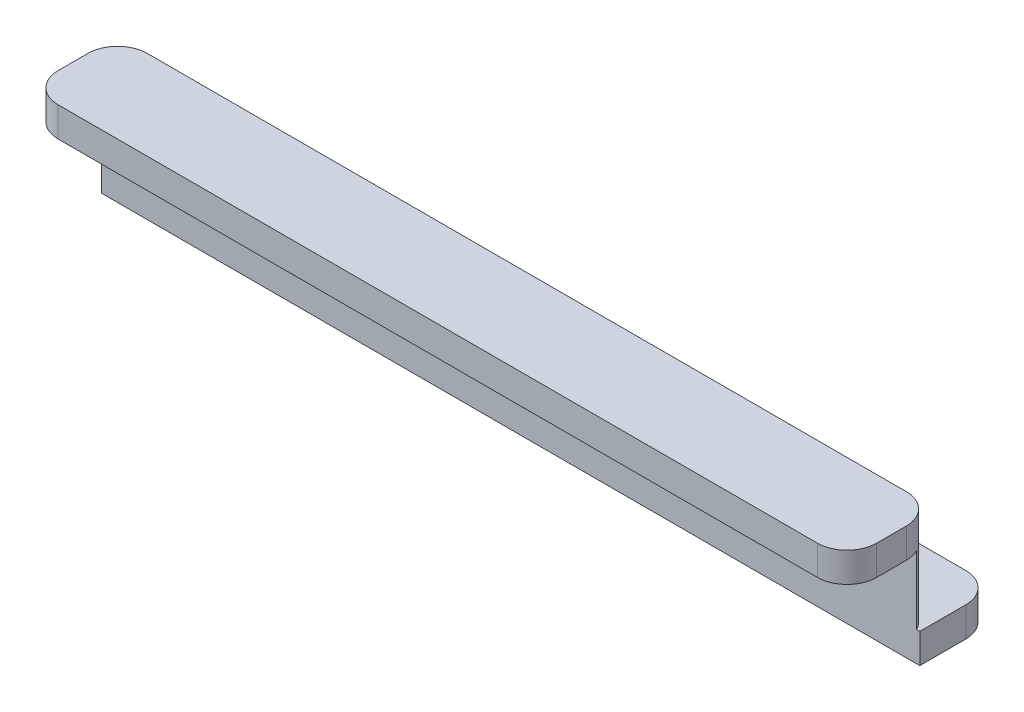
ISO-10303-21;
HEADER;
FILE_DESCRIPTION(('STEP AP214'),'2;1');
FILE_NAME('part.step','',(''),(''),'','','');
FILE_SCHEMA(('AUTOMOTIVE_DESIGN { 1 0 10303 214 1 1 1 1 }'));
ENDSEC;
DATA;
#1=APPLICATION_CONTEXT('core data for automotive mechanical design processes');
#2=APPLICATION_PROTOCOL_DEFINITION('international standard','automotive_design',2000,#1);
#3=PRODUCT_CONTEXT('',#1,'mechanical');
#4=PRODUCT('Part','Part','',(#3));
#5=PRODUCT_RELATED_PRODUCT_CATEGORY('part','',(#4));
#6=PRODUCT_DEFINITION_FORMATION('','',#4);
#7=PRODUCT_DEFINITION_CONTEXT('part definition',#1,'design');
#8=PRODUCT_DEFINITION('design','',#6,#7);
#9=PRODUCT_DEFINITION_SHAPE('','',#8);
#10=(LENGTH_UNIT() NAMED_UNIT(*) SI_UNIT(.MILLI.,.METRE.));
#11=(NAMED_UNIT(*) PLANE_ANGLE_UNIT() SI_UNIT($,.RADIAN.));
#12=(NAMED_UNIT(*) SI_UNIT($,.STERADIAN.) SOLID_ANGLE_UNIT());
#13=UNCERTAINTY_MEASURE_WITH_UNIT(LENGTH_MEASURE(1.E-05),#10,'distance_accuracy_value','');
#14=(GEOMETRIC_REPRESENTATION_CONTEXT(3) GLOBAL_UNCERTAINTY_ASSIGNED_CONTEXT((#13)) GLOBAL_UNIT_ASSIGNED_CONTEXT((#10,
#11,#12)) REPRESENTATION_CONTEXT('',''));
#15=CARTESIAN_POINT('',(0.,0.,0.));
#16=DIRECTION('',(0.,0.,1.));
#17=DIRECTION('',(1.,0.,0.));
#18=AXIS2_PLACEMENT_3D('',#15,#16,#17);
#19=CARTESIAN_POINT('',(53.15,2.,-4.));
#20=DIRECTION('',(0.,-1.,0.));
#21=DIRECTION('',(0.,0.,-1.));
#22=AXIS2_PLACEMENT_3D('',#19,#20,#21);
#23=CYLINDRICAL_SURFACE('',#22,2.);
#24=DIRECTION('',(0.,-1.,0.));
#25=VECTOR('',#24,1.);
#26=CARTESIAN_POINT('',(54.9360571099495,2.,-4.89999999999942));
#27=LINE('',#26,#25);
#28=CARTESIAN_POINT('',(54.9360571099494,-4.60000000000129,-4.89999999999942));
#29=VERTEX_POINT('',#28);
#30=CARTESIAN_POINT('',(54.9360571099495,0.,-4.89999999999942));
#31=VERTEX_POINT('',#30);
#32=EDGE_CURVE('E215',#29,#31,#27,.F.);
#33=ORIENTED_EDGE('',*,*,#32,.F.);
#34=CARTESIAN_POINT('',(53.15,-4.6000000000013,-4.));
#35=DIRECTION('',(0.,1.,0.));
#36=DIRECTION('',(1.,0.,0.));
#37=AXIS2_PLACEMENT_3D('',#34,#35,#36);
#38=CIRCLE('',#37,2.);
#39=CARTESIAN_POINT('',(53.15,-4.6000000000013,-5.99999999999999));
#40=VERTEX_POINT('',#39);
#41=EDGE_CURVE('E253',#29,#40,#38,.T.);
#42=ORIENTED_EDGE('',*,*,#41,.T.);
#43=DIRECTION('',(0.,-1.,0.));
#44=VECTOR('',#43,1.);
#45=CARTESIAN_POINT('',(53.15,2.,-6.));
#46=LINE('',#45,#44);
#47=CARTESIAN_POINT('',(53.15,2.,-6.));
#48=VERTEX_POINT('',#47);
#49=EDGE_CURVE('E209',#48,#40,#46,.T.);
#50=ORIENTED_EDGE('',*,*,#49,.F.);
#51=CARTESIAN_POINT('',(53.15,2.,-4.));
#52=DIRECTION('',(0.,1.,0.));
#53=DIRECTION('',(0.,0.,-1.));
#54=AXIS2_PLACEMENT_3D('',#51,#52,#53);
#55=CIRCLE('',#54,2.);
#56=CARTESIAN_POINT('',(55.15,2.,-4.));
#57=VERTEX_POINT('',#56);
#58=EDGE_CURVE('E168',#57,#48,#55,.T.);
#59=ORIENTED_EDGE('',*,*,#58,.F.);
#60=DIRECTION('',(0.,-1.,0.));
#61=VECTOR('',#60,1.);
#62=CARTESIAN_POINT('',(55.15,2.,-4.));
#63=LINE('',#62,#61);
#64=CARTESIAN_POINT('',(55.15,0.,-4.));
#65=VERTEX_POINT('',#64);
#66=EDGE_CURVE('E185',#57,#65,#63,.T.);
#67=ORIENTED_EDGE('',*,*,#66,.T.);
#68=CARTESIAN_POINT('',(53.15,0.,-4.));
#69=DIRECTION('',(0.,1.,0.));
#70=DIRECTION('',(0.,0.,1.));
#71=AXIS2_PLACEMENT_3D('',#68,#69,#70);
#72=CIRCLE('',#71,2.);
#73=EDGE_CURVE('E226',#65,#31,#72,.T.);
#74=ORIENTED_EDGE('',*,*,#73,.T.);
#75=EDGE_LOOP('',(#33,#42,#50,#59,#67,#74));
#76=FACE_BOUND('',#75,.T.);
#77=ADVANCED_FACE('F32',(#76),#23,.T.);
#78=CARTESIAN_POINT('',(2.,2.,-4.));
#79=DIRECTION('',(0.,-1.,0.));
#80=DIRECTION('',(0.,0.,-1.));
#81=AXIS2_PLACEMENT_3D('',#78,#79,#80);
#82=CYLINDRICAL_SURFACE('',#81,2.);
#83=DIRECTION('',(0.,-1.,0.));
#84=VECTOR('',#83,1.);
#85=CARTESIAN_POINT('',(0.213942890050535,2.,-4.89999999999942));
#86=LINE('',#85,#84);
#87=CARTESIAN_POINT('',(0.213942890050535,0.,-4.89999999999942));
#88=VERTEX_POINT('',#87);
#89=CARTESIAN_POINT('',(0.213942890050525,-4.60000000000167,-4.89999999999942));
#90=VERTEX_POINT('',#89);
#91=EDGE_CURVE('E52',#88,#90,#86,.T.);
#92=ORIENTED_EDGE('',*,*,#91,.F.);
#93=CARTESIAN_POINT('',(2.,0.,-4.));
#94=DIRECTION('',(0.,1.,0.));
#95=DIRECTION('',(0.,0.,1.));
#96=AXIS2_PLACEMENT_3D('',#93,#94,#95);
#97=CIRCLE('',#96,2.);
#98=CARTESIAN_POINT('',(0.,0.,-4.));
#99=VERTEX_POINT('',#98);
#100=EDGE_CURVE('E219',#88,#99,#97,.T.);
#101=ORIENTED_EDGE('',*,*,#100,.T.);
#102=DIRECTION('',(0.,-1.,0.));
#103=VECTOR('',#102,1.);
#104=CARTESIAN_POINT('',(0.,2.,-4.));
#105=LINE('',#104,#103);
#106=CARTESIAN_POINT('',(0.,2.,-4.));
#107=VERTEX_POINT('',#106);
#108=EDGE_CURVE('E203',#107,#99,#105,.T.);
#109=ORIENTED_EDGE('',*,*,#108,.F.);
#110=CARTESIAN_POINT('',(2.,2.,-4.));
#111=DIRECTION('',(0.,1.,0.));
#112=DIRECTION('',(0.,0.,-1.));
#113=AXIS2_PLACEMENT_3D('',#110,#111,#112);
#114=CIRCLE('',#113,2.);
#115=CARTESIAN_POINT('',(2.,2.,-6.));
#116=VERTEX_POINT('',#115);
#117=EDGE_CURVE('E174',#116,#107,#114,.T.);
#118=ORIENTED_EDGE('',*,*,#117,.F.);
#119=DIRECTION('',(0.,-1.,0.));
#120=VECTOR('',#119,1.);
#121=CARTESIAN_POINT('',(2.,2.,-6.));
#122=LINE('',#121,#120);
#123=CARTESIAN_POINT('',(1.99999999999999,-4.60000000000165,-5.99999999999999));
#124=VERTEX_POINT('',#123);
#125=EDGE_CURVE('E206',#116,#124,#122,.T.);
#126=ORIENTED_EDGE('',*,*,#125,.T.);
#127=CARTESIAN_POINT('',(1.99999999999999,-4.60000000000166,-4.));
#128=DIRECTION('',(0.,1.,0.));
#129=DIRECTION('',(1.,0.,0.));
#130=AXIS2_PLACEMENT_3D('',#127,#128,#129);
#131=CIRCLE('',#130,2.);
#132=EDGE_CURVE('E230',#124,#90,#131,.T.);
#133=ORIENTED_EDGE('',*,*,#132,.T.);
#134=EDGE_LOOP('',(#92,#101,#109,#118,#126,#133));
#135=FACE_BOUND('',#134,.T.);
#136=ADVANCED_FACE('F229',(#135),#82,.T.);
#137=CARTESIAN_POINT('',(0.,2.,-2.));
#138=DIRECTION('',(1.,0.,0.));
#139=DIRECTION('',(0.,0.,-1.));
#140=AXIS2_PLACEMENT_3D('',#137,#138,#139);
#141=PLANE('',#140);
#142=DIRECTION('',(0.,1.,0.));
#143=VECTOR('',#142,1.);
#144=CARTESIAN_POINT('',(0.,-6.60000000000168,-4.89999999999942));
#145=LINE('',#144,#143);
#146=CARTESIAN_POINT('',(0.,-6.60000000000168,-4.89999999999942));
#147=VERTEX_POINT('',#146);
#148=CARTESIAN_POINT('',(0.,-4.60000000000148,-4.89999999999942));
#149=VERTEX_POINT('',#148);
#150=EDGE_CURVE('E153',#147,#149,#145,.T.);
#151=ORIENTED_EDGE('',*,*,#150,.T.);
#152=DIRECTION('',(0.,0.,-1.));
#153=VECTOR('',#152,1.);
#154=CARTESIAN_POINT('',(0.,-4.60000000000167,-4.));
#155=LINE('',#154,#153);
#156=CARTESIAN_POINT('',(0.,-4.60000000000166,-7.99999999999999));
#157=VERTEX_POINT('',#156);
#158=EDGE_CURVE('E238',#149,#157,#155,.T.);
#159=ORIENTED_EDGE('',*,*,#158,.T.);
#160=DIRECTION('',(0.,-1.,0.));
#161=VECTOR('',#160,1.);
#162=CARTESIAN_POINT('',(0.,-4.60000000000166,-7.99999999999999));
#163=LINE('',#162,#161);
#164=CARTESIAN_POINT('',(0.,-6.60000000000166,-8.));
#165=VERTEX_POINT('',#164);
#166=EDGE_CURVE('E160',#157,#165,#163,.T.);
#167=ORIENTED_EDGE('',*,*,#166,.T.);
#168=DIRECTION('',(0.,0.,-1.));
#169=VECTOR('',#168,1.);
#170=CARTESIAN_POINT('',(0.,-6.60000000000168,-3.99999999999987));
#171=LINE('',#170,#169);
#172=EDGE_CURVE('E146',#147,#165,#171,.T.);
#173=ORIENTED_EDGE('',*,*,#172,.F.);
#174=EDGE_LOOP('',(#151,#159,#167,#173));
#175=FACE_BOUND('',#174,.T.);
#176=ADVANCED_FACE('F158',(#175),#141,.F.);
#177=CARTESIAN_POINT('',(55.15,2.,-2.));
#178=DIRECTION('',(-1.,0.,0.));
#179=DIRECTION('',(0.,0.,1.));
#180=AXIS2_PLACEMENT_3D('',#177,#178,#179);
#181=PLANE('',#180);
#182=DIRECTION('',(0.,1.,0.));
#183=VECTOR('',#182,1.);
#184=CARTESIAN_POINT('',(55.15,-6.60000000000168,-4.89999999999942));
#185=LINE('',#184,#183);
#186=CARTESIAN_POINT('',(55.15,-6.60000000000168,-4.89999999999942));
#187=VERTEX_POINT('',#186);
#188=CARTESIAN_POINT('',(55.15,-4.60000000000129,-4.89999999999942));
#189=VERTEX_POINT('',#188);
#190=EDGE_CURVE('E45',#187,#189,#185,.T.);
#191=ORIENTED_EDGE('',*,*,#190,.F.);
#192=DIRECTION('',(0.,0.,1.));
#193=VECTOR('',#192,1.);
#194=CARTESIAN_POINT('',(55.15,-6.60000000000129,-1.99999999999987));
#195=LINE('',#194,#193);
#196=CARTESIAN_POINT('',(55.15,-6.60000000000128,-8.));
#197=VERTEX_POINT('',#196);
#198=EDGE_CURVE('E149',#197,#187,#195,.T.);
#199=ORIENTED_EDGE('',*,*,#198,.F.);
#200=DIRECTION('',(0.,-1.,0.));
#201=VECTOR('',#200,1.);
#202=CARTESIAN_POINT('',(55.15,-4.60000000000128,-7.99999999999999));
#203=LINE('',#202,#201);
#204=CARTESIAN_POINT('',(55.15,-4.60000000000128,-7.99999999999999));
#205=VERTEX_POINT('',#204);
#206=EDGE_CURVE('E150',#205,#197,#203,.T.);
#207=ORIENTED_EDGE('',*,*,#206,.F.);
#208=DIRECTION('',(0.,0.,1.));
#209=VECTOR('',#208,1.);
#210=CARTESIAN_POINT('',(55.15,-4.60000000000128,-7.99999999999999));
#211=LINE('',#210,#209);
#212=EDGE_CURVE('E250',#205,#189,#211,.T.);
#213=ORIENTED_EDGE('',*,*,#212,.T.);
#214=EDGE_LOOP('',(#191,#199,#207,#213));
#215=FACE_BOUND('',#214,.T.);
#216=ADVANCED_FACE('F282',(#215),#181,.F.);
#217=CARTESIAN_POINT('',(58.1670864842163,-6.60000000000159,134.695));
#218=DIRECTION('',(0.,1.,0.));
#219=DIRECTION('',(-1.,0.,0.));
#220=AXIS2_PLACEMENT_3D('',#217,#218,#219);
#221=PLANE('',#220);
#222=DIRECTION('',(-1.,0.,0.));
#223=VECTOR('',#222,1.);
#224=CARTESIAN_POINT('',(3.99999999999824,-6.60000000000165,-4.89999999999942));
#225=LINE('',#224,#223);
#226=EDGE_CURVE('E141',#187,#147,#225,.T.);
#227=ORIENTED_EDGE('',*,*,#226,.T.);
#228=ORIENTED_EDGE('',*,*,#172,.T.);
#229=CARTESIAN_POINT('',(2.00000000000005,-6.60000000000165,-8.));
#230=DIRECTION('',(0.,-1.,0.));
#231=DIRECTION('',(1.,0.,0.));
#232=AXIS2_PLACEMENT_3D('',#229,#230,#231);
#233=CIRCLE('',#232,2.);
#234=CARTESIAN_POINT('',(2.00000000000005,-6.60000000000164,-10.));
#235=VERTEX_POINT('',#234);
#236=EDGE_CURVE('E236',#165,#235,#233,.T.);
#237=ORIENTED_EDGE('',*,*,#236,.T.);
#238=DIRECTION('',(1.,0.,0.));
#239=VECTOR('',#238,1.);
#240=CARTESIAN_POINT('',(2.00000000000005,-6.60000000000164,-10.));
#241=LINE('',#240,#239);
#242=CARTESIAN_POINT('',(53.15,-6.60000000000129,-10.));
#243=VERTEX_POINT('',#242);
#244=EDGE_CURVE('E259',#235,#243,#241,.T.);
#245=ORIENTED_EDGE('',*,*,#244,.T.);
#246=CARTESIAN_POINT('',(53.15,-6.60000000000129,-8.));
#247=DIRECTION('',(0.,-1.,0.));
#248=DIRECTION('',(1.,0.,0.));
#249=AXIS2_PLACEMENT_3D('',#246,#247,#248);
#250=CIRCLE('',#249,2.);
#251=EDGE_CURVE('E239',#243,#197,#250,.T.);
#252=ORIENTED_EDGE('',*,*,#251,.T.);
#253=ORIENTED_EDGE('',*,*,#198,.T.);
#254=EDGE_LOOP('',(#227,#228,#237,#245,#252,#253));
#255=FACE_BOUND('',#254,.T.);
#256=ADVANCED_FACE('F143',(#255),#221,.F.);
#257=CARTESIAN_POINT('',(1.99999999999999,-4.60000000000166,-4.));
#258=DIRECTION('',(0.,-1.,0.));
#259=DIRECTION('',(1.,0.,0.));
#260=AXIS2_PLACEMENT_3D('',#257,#258,#259);
#261=PLANE('',#260);
#262=DIRECTION('',(-1.,0.,0.));
#263=VECTOR('',#262,1.);
#264=CARTESIAN_POINT('',(1.99999999999999,-4.60000000000166,-4.89999999999942));
#265=LINE('',#264,#263);
#266=EDGE_CURVE('E11',#189,#29,#265,.T.);
#267=ORIENTED_EDGE('',*,*,#266,.F.);
#268=ORIENTED_EDGE('',*,*,#212,.F.);
#269=CARTESIAN_POINT('',(53.15,-4.60000000000129,-7.99999999999999));
#270=DIRECTION('',(0.,-1.,0.));
#271=DIRECTION('',(1.,0.,0.));
#272=AXIS2_PLACEMENT_3D('',#269,#270,#271);
#273=CIRCLE('',#272,2.);
#274=CARTESIAN_POINT('',(53.15,-4.60000000000129,-9.99999999999999));
#275=VERTEX_POINT('',#274);
#276=EDGE_CURVE('E247',#275,#205,#273,.T.);
#277=ORIENTED_EDGE('',*,*,#276,.F.);
#278=DIRECTION('',(1.,0.,0.));
#279=VECTOR('',#278,1.);
#280=CARTESIAN_POINT('',(2.00000000000003,-4.60000000000164,-9.99999999999999));
#281=LINE('',#280,#279);
#282=CARTESIAN_POINT('',(2.00000000000003,-4.60000000000164,-9.99999999999999));
#283=VERTEX_POINT('',#282);
#284=EDGE_CURVE('E244',#283,#275,#281,.T.);
#285=ORIENTED_EDGE('',*,*,#284,.F.);
#286=CARTESIAN_POINT('',(2.00000000000003,-4.60000000000165,-7.99999999999999));
#287=DIRECTION('',(0.,-1.,0.));
#288=DIRECTION('',(1.,0.,0.));
#289=AXIS2_PLACEMENT_3D('',#286,#287,#288);
#290=CIRCLE('',#289,2.);
#291=EDGE_CURVE('E241',#157,#283,#290,.T.);
#292=ORIENTED_EDGE('',*,*,#291,.F.);
#293=ORIENTED_EDGE('',*,*,#158,.F.);
#294=EDGE_CURVE('E35',#90,#149,#265,.T.);
#295=ORIENTED_EDGE('',*,*,#294,.F.);
#296=ORIENTED_EDGE('',*,*,#132,.F.);
#297=DIRECTION('',(-1.,0.,0.));
#298=VECTOR('',#297,1.);
#299=CARTESIAN_POINT('',(1.99999999999999,-4.60000000000165,-5.99999999999999));
#300=LINE('',#299,#298);
#301=EDGE_CURVE('E255',#40,#124,#300,.T.);
#302=ORIENTED_EDGE('',*,*,#301,.F.);
#303=ORIENTED_EDGE('',*,*,#41,.F.);
#304=EDGE_LOOP('',(#267,#268,#277,#285,#292,#293,#295,#296,#302,#303));
#305=FACE_BOUND('',#304,.T.);
#306=ADVANCED_FACE('F284',(#305),#261,.F.);
#307=CARTESIAN_POINT('',(2.,2.,-6.));
#308=DIRECTION('',(0.,0.,1.));
#309=DIRECTION('',(1.,0.,0.));
#310=AXIS2_PLACEMENT_3D('',#307,#308,#309);
#311=PLANE('',#310);
#312=ORIENTED_EDGE('',*,*,#301,.T.);
#313=ORIENTED_EDGE('',*,*,#125,.F.);
#314=DIRECTION('',(-1.,0.,0.));
#315=VECTOR('',#314,1.);
#316=CARTESIAN_POINT('',(2.,2.,-6.));
#317=LINE('',#316,#315);
#318=EDGE_CURVE('E171',#48,#116,#317,.T.);
#319=ORIENTED_EDGE('',*,*,#318,.F.);
#320=ORIENTED_EDGE('',*,*,#49,.T.);
#321=EDGE_LOOP('',(#312,#313,#319,#320));
#322=FACE_BOUND('',#321,.T.);
#323=ADVANCED_FACE('F321',(#322),#311,.F.);
#324=ORIENTED_EDGE('',*,*,#108,.T.);
#325=DIRECTION('',(0.,0.,-1.));
#326=VECTOR('',#325,1.);
#327=CARTESIAN_POINT('',(0.,0.,0.));
#328=LINE('',#327,#326);
#329=CARTESIAN_POINT('',(0.,0.,-2.));
#330=VERTEX_POINT('',#329);
#331=EDGE_CURVE('E223',#330,#99,#328,.T.);
#332=ORIENTED_EDGE('',*,*,#331,.F.);
#333=DIRECTION('',(0.,-1.,0.));
#334=VECTOR('',#333,1.);
#335=CARTESIAN_POINT('',(0.,2.,-2.));
#336=LINE('',#335,#334);
#337=CARTESIAN_POINT('',(0.,2.,-2.));
#338=VERTEX_POINT('',#337);
#339=EDGE_CURVE('E200',#338,#330,#336,.T.);
#340=ORIENTED_EDGE('',*,*,#339,.F.);
#341=DIRECTION('',(0.,0.,1.));
#342=VECTOR('',#341,1.);
#343=CARTESIAN_POINT('',(0.,2.,-2.));
#344=LINE('',#343,#342);
#345=EDGE_CURVE('E176',#107,#338,#344,.T.);
#346=ORIENTED_EDGE('',*,*,#345,.F.);
#347=EDGE_LOOP('',(#324,#332,#340,#346));
#348=FACE_BOUND('',#347,.T.);
#349=ADVANCED_FACE('F315',(#348),#141,.F.);
#350=CARTESIAN_POINT('',(2.,2.,-2.));
#351=DIRECTION('',(0.,-1.,0.));
#352=DIRECTION('',(0.,0.,-1.));
#353=AXIS2_PLACEMENT_3D('',#350,#351,#352);
#354=CYLINDRICAL_SURFACE('',#353,2.);
#355=ORIENTED_EDGE('',*,*,#339,.T.);
#356=CARTESIAN_POINT('',(2.,0.,-2.));
#357=DIRECTION('',(0.,1.,0.));
#358=DIRECTION('',(0.,0.,-1.));
#359=AXIS2_PLACEMENT_3D('',#356,#357,#358);
#360=CIRCLE('',#359,2.);
#361=CARTESIAN_POINT('',(2.,0.,0.));
#362=VERTEX_POINT('',#361);
#363=EDGE_CURVE('E162',#330,#362,#360,.T.);
#364=ORIENTED_EDGE('',*,*,#363,.T.);
#365=DIRECTION('',(0.,-1.,0.));
#366=VECTOR('',#365,1.);
#367=CARTESIAN_POINT('',(2.,2.,0.));
#368=LINE('',#367,#366);
#369=CARTESIAN_POINT('',(2.,2.,0.));
#370=VERTEX_POINT('',#369);
#371=EDGE_CURVE('E197',#370,#362,#368,.T.);
#372=ORIENTED_EDGE('',*,*,#371,.F.);
#373=CARTESIAN_POINT('',(2.,2.,-2.));
#374=DIRECTION('',(0.,1.,0.));
#375=DIRECTION('',(0.,0.,-1.));
#376=AXIS2_PLACEMENT_3D('',#373,#374,#375);
#377=CIRCLE('',#376,2.);
#378=EDGE_CURVE('E178',#338,#370,#377,.T.);
#379=ORIENTED_EDGE('',*,*,#378,.F.);
#380=EDGE_LOOP('',(#355,#364,#372,#379));
#381=FACE_BOUND('',#380,.T.);
#382=ADVANCED_FACE('F311',(#381),#354,.T.);
#383=CARTESIAN_POINT('',(2.,2.,0.));
#384=DIRECTION('',(0.,0.,-1.));
#385=DIRECTION('',(-1.,0.,0.));
#386=AXIS2_PLACEMENT_3D('',#383,#384,#385);
#387=PLANE('',#386);
#388=DIRECTION('',(1.,0.,0.));
#389=VECTOR('',#388,1.);
#390=CARTESIAN_POINT('',(2.,0.,0.));
#391=LINE('',#390,#389);
#392=CARTESIAN_POINT('',(53.15,0.,0.));
#393=VERTEX_POINT('',#392);
#394=EDGE_CURVE('E164',#362,#393,#391,.T.);
#395=ORIENTED_EDGE('',*,*,#394,.T.);
#396=DIRECTION('',(0.,-1.,0.));
#397=VECTOR('',#396,1.);
#398=CARTESIAN_POINT('',(53.15,2.,0.));
#399=LINE('',#398,#397);
#400=CARTESIAN_POINT('',(53.15,2.,0.));
#401=VERTEX_POINT('',#400);
#402=EDGE_CURVE('E194',#401,#393,#399,.T.);
#403=ORIENTED_EDGE('',*,*,#402,.F.);
#404=DIRECTION('',(1.,0.,0.));
#405=VECTOR('',#404,1.);
#406=CARTESIAN_POINT('',(2.,2.,0.));
#407=LINE('',#406,#405);
#408=EDGE_CURVE('E180',#370,#401,#407,.T.);
#409=ORIENTED_EDGE('',*,*,#408,.F.);
#410=ORIENTED_EDGE('',*,*,#371,.T.);
#411=EDGE_LOOP('',(#395,#403,#409,#410));
#412=FACE_BOUND('',#411,.T.);
#413=ADVANCED_FACE('F306',(#412),#387,.F.);
#414=CARTESIAN_POINT('',(53.15,2.,-2.));
#415=DIRECTION('',(0.,-1.,0.));
#416=DIRECTION('',(0.,0.,-1.));
#417=AXIS2_PLACEMENT_3D('',#414,#415,#416);
#418=CYLINDRICAL_SURFACE('',#417,2.);
#419=CARTESIAN_POINT('',(53.15,0.,-2.));
#420=DIRECTION('',(0.,1.,0.));
#421=DIRECTION('',(0.,0.,1.));
#422=AXIS2_PLACEMENT_3D('',#419,#420,#421);
#423=CIRCLE('',#422,2.);
#424=CARTESIAN_POINT('',(55.15,0.,-2.));
#425=VERTEX_POINT('',#424);
#426=EDGE_CURVE('E172',#393,#425,#423,.T.);
#427=ORIENTED_EDGE('',*,*,#426,.T.);
#428=DIRECTION('',(0.,-1.,0.));
#429=VECTOR('',#428,1.);
#430=CARTESIAN_POINT('',(55.15,2.,-2.));
#431=LINE('',#430,#429);
#432=CARTESIAN_POINT('',(55.15,2.,-2.));
#433=VERTEX_POINT('',#432);
#434=EDGE_CURVE('E191',#433,#425,#431,.T.);
#435=ORIENTED_EDGE('',*,*,#434,.F.);
#436=CARTESIAN_POINT('',(53.15,2.,-2.));
#437=DIRECTION('',(0.,1.,0.));
#438=DIRECTION('',(0.,0.,1.));
#439=AXIS2_PLACEMENT_3D('',#436,#437,#438);
#440=CIRCLE('',#439,2.);
#441=EDGE_CURVE('E182',#401,#433,#440,.T.);
#442=ORIENTED_EDGE('',*,*,#441,.F.);
#443=ORIENTED_EDGE('',*,*,#402,.T.);
#444=EDGE_LOOP('',(#427,#435,#442,#443));
#445=FACE_BOUND('',#444,.T.);
#446=ADVANCED_FACE('F302',(#445),#418,.T.);
#447=ORIENTED_EDGE('',*,*,#434,.T.);
#448=DIRECTION('',(0.,0.,1.));
#449=VECTOR('',#448,1.);
#450=CARTESIAN_POINT('',(55.15,0.,0.));
#451=LINE('',#450,#449);
#452=EDGE_CURVE('E293',#65,#425,#451,.T.);
#453=ORIENTED_EDGE('',*,*,#452,.F.);
#454=ORIENTED_EDGE('',*,*,#66,.F.);
#455=DIRECTION('',(0.,0.,-1.));
#456=VECTOR('',#455,1.);
#457=CARTESIAN_POINT('',(55.15,2.,-2.));
#458=LINE('',#457,#456);
#459=EDGE_CURVE('E184',#433,#57,#458,.T.);
#460=ORIENTED_EDGE('',*,*,#459,.F.);
#461=EDGE_LOOP('',(#447,#453,#454,#460));
#462=FACE_BOUND('',#461,.T.);
#463=ADVANCED_FACE('F295',(#462),#181,.F.);
#464=CARTESIAN_POINT('',(53.15,2.,-4.));
#465=DIRECTION('',(0.,-1.,0.));
#466=DIRECTION('',(0.,0.,-1.));
#467=AXIS2_PLACEMENT_3D('',#464,#465,#466);
#468=PLANE('',#467);
#469=ORIENTED_EDGE('',*,*,#441,.T.);
#470=ORIENTED_EDGE('',*,*,#459,.T.);
#471=ORIENTED_EDGE('',*,*,#58,.T.);
#472=ORIENTED_EDGE('',*,*,#318,.T.);
#473=ORIENTED_EDGE('',*,*,#117,.T.);
#474=ORIENTED_EDGE('',*,*,#345,.T.);
#475=ORIENTED_EDGE('',*,*,#378,.T.);
#476=ORIENTED_EDGE('',*,*,#408,.T.);
#477=EDGE_LOOP('',(#469,#470,#471,#472,#473,#474,#475,#476));
#478=FACE_BOUND('',#477,.T.);
#479=ADVANCED_FACE('F319',(#478),#468,.F.);
#480=CARTESIAN_POINT('',(53.15,0.,-4.));
#481=DIRECTION('',(0.,-1.,0.));
#482=DIRECTION('',(0.,0.,-1.));
#483=AXIS2_PLACEMENT_3D('',#480,#481,#482);
#484=PLANE('',#483);
#485=ORIENTED_EDGE('',*,*,#452,.T.);
#486=ORIENTED_EDGE('',*,*,#426,.F.);
#487=ORIENTED_EDGE('',*,*,#394,.F.);
#488=ORIENTED_EDGE('',*,*,#363,.F.);
#489=ORIENTED_EDGE('',*,*,#331,.T.);
#490=ORIENTED_EDGE('',*,*,#100,.F.);
#491=DIRECTION('',(-1.,0.,0.));
#492=VECTOR('',#491,1.);
#493=CARTESIAN_POINT('',(53.15,0.,-4.89999999999942));
#494=LINE('',#493,#492);
#495=EDGE_CURVE('E211',#31,#88,#494,.T.);
#496=ORIENTED_EDGE('',*,*,#495,.F.);
#497=ORIENTED_EDGE('',*,*,#73,.F.);
#498=EDGE_LOOP('',(#485,#486,#487,#488,#489,#490,#496,#497));
#499=FACE_BOUND('',#498,.T.);
#500=ADVANCED_FACE('F221',(#499),#484,.T.);
#501=CARTESIAN_POINT('',(3.99999999999863,-62.0710666415743,-4.89999999999942));
#502=DIRECTION('',(0.,0.,1.));
#503=DIRECTION('',(1.,0.,0.));
#504=AXIS2_PLACEMENT_3D('',#501,#502,#503);
#505=PLANE('',#504);
#506=ORIENTED_EDGE('',*,*,#226,.F.);
#507=ORIENTED_EDGE('',*,*,#190,.T.);
#508=ORIENTED_EDGE('',*,*,#266,.T.);
#509=ORIENTED_EDGE('',*,*,#32,.T.);
#510=ORIENTED_EDGE('',*,*,#495,.T.);
#511=ORIENTED_EDGE('',*,*,#91,.T.);
#512=ORIENTED_EDGE('',*,*,#294,.T.);
#513=ORIENTED_EDGE('',*,*,#150,.F.);
#514=EDGE_LOOP('',(#506,#507,#508,#509,#510,#511,#512,#513));
#515=FACE_BOUND('',#514,.T.);
#516=ADVANCED_FACE('F154',(#515),#505,.T.);
#517=CARTESIAN_POINT('',(53.15,-4.60000000000129,-7.99999999999999));
#518=DIRECTION('',(0.,-1.,0.));
#519=DIRECTION('',(1.,0.,0.));
#520=AXIS2_PLACEMENT_3D('',#517,#518,#519);
#521=CYLINDRICAL_SURFACE('',#520,2.);
#522=ORIENTED_EDGE('',*,*,#251,.F.);
#523=DIRECTION('',(0.,-1.,0.));
#524=VECTOR('',#523,1.);
#525=CARTESIAN_POINT('',(53.15,-4.60000000000129,-9.99999999999999));
#526=LINE('',#525,#524);
#527=EDGE_CURVE('E265',#275,#243,#526,.T.);
#528=ORIENTED_EDGE('',*,*,#527,.F.);
#529=ORIENTED_EDGE('',*,*,#276,.T.);
#530=ORIENTED_EDGE('',*,*,#206,.T.);
#531=EDGE_LOOP('',(#522,#528,#529,#530));
#532=FACE_BOUND('',#531,.T.);
#533=ADVANCED_FACE('F278',(#532),#521,.T.);
#534=CARTESIAN_POINT('',(2.00000000000003,-4.60000000000164,-9.99999999999999));
#535=DIRECTION('',(0.,0.,-1.));
#536=DIRECTION('',(0.,1.,0.));
#537=AXIS2_PLACEMENT_3D('',#534,#535,#536);
#538=PLANE('',#537);
#539=ORIENTED_EDGE('',*,*,#244,.F.);
#540=DIRECTION('',(0.,-1.,0.));
#541=VECTOR('',#540,1.);
#542=CARTESIAN_POINT('',(2.00000000000003,-4.60000000000164,-9.99999999999999));
#543=LINE('',#542,#541);
#544=EDGE_CURVE('E267',#283,#235,#543,.T.);
#545=ORIENTED_EDGE('',*,*,#544,.F.);
#546=ORIENTED_EDGE('',*,*,#284,.T.);
#547=ORIENTED_EDGE('',*,*,#527,.T.);
#548=EDGE_LOOP('',(#539,#545,#546,#547));
#549=FACE_BOUND('',#548,.T.);
#550=ADVANCED_FACE('F275',(#549),#538,.T.);
#551=CARTESIAN_POINT('',(2.00000000000003,-4.60000000000165,-7.99999999999999));
#552=DIRECTION('',(0.,-1.,0.));
#553=DIRECTION('',(1.,0.,0.));
#554=AXIS2_PLACEMENT_3D('',#551,#552,#553);
#555=CYLINDRICAL_SURFACE('',#554,2.);
#556=ORIENTED_EDGE('',*,*,#236,.F.);
#557=ORIENTED_EDGE('',*,*,#166,.F.);
#558=ORIENTED_EDGE('',*,*,#291,.T.);
#559=ORIENTED_EDGE('',*,*,#544,.T.);
#560=EDGE_LOOP('',(#556,#557,#558,#559));
#561=FACE_BOUND('',#560,.T.);
#562=ADVANCED_FACE('F271',(#561),#555,.T.);
#563=CLOSED_SHELL('',(#77,#136,#176,#216,#256,#306,#323,#349,#382,#413,#446,#463,#479,#500,#516,
#533,#550,#562));
#564=MANIFOLD_SOLID_BREP('B2',#563);
#565=ADVANCED_BREP_SHAPE_REPRESENTATION('',(#18,#564),#14);
#566=SHAPE_DEFINITION_REPRESENTATION(#9,#565);
ENDSEC;
END-ISO-10303-21;
